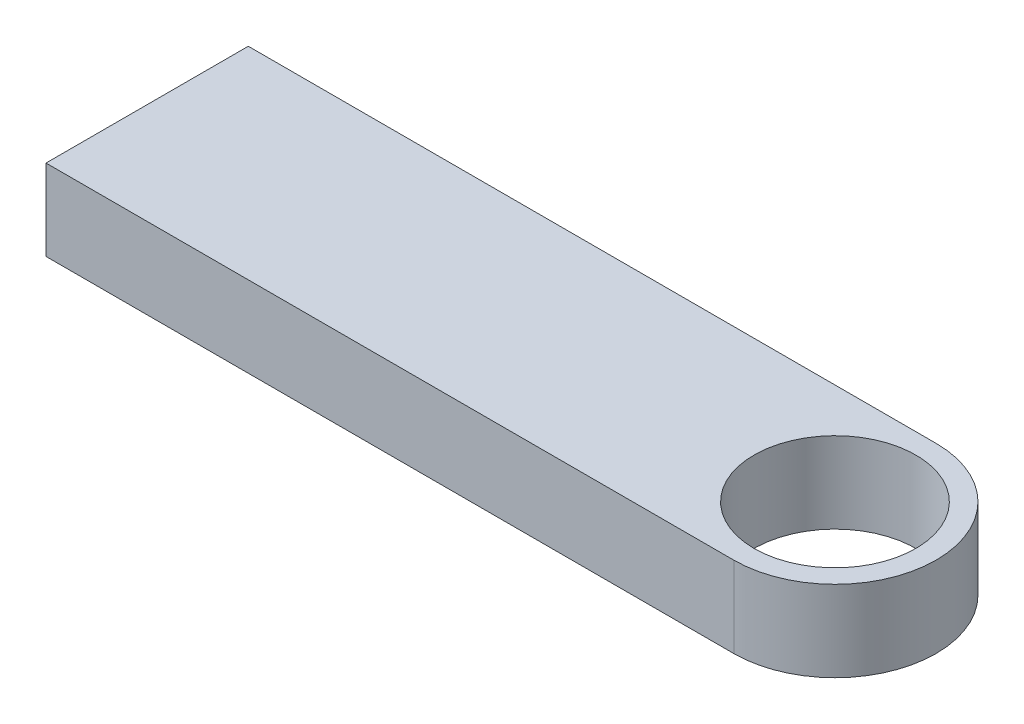
ISO-10303-21;
HEADER;
FILE_DESCRIPTION(('STEP AP214'),'2;1');
FILE_NAME('part.step','',(''),(''),'','','');
FILE_SCHEMA(('AUTOMOTIVE_DESIGN { 1 0 10303 214 1 1 1 1 }'));
ENDSEC;
DATA;
#1=APPLICATION_CONTEXT('core data for automotive mechanical design processes');
#2=APPLICATION_PROTOCOL_DEFINITION('international standard','automotive_design',2000,#1);
#3=PRODUCT_CONTEXT('',#1,'mechanical');
#4=PRODUCT('Part','Part','',(#3));
#5=PRODUCT_RELATED_PRODUCT_CATEGORY('part','',(#4));
#6=PRODUCT_DEFINITION_FORMATION('','',#4);
#7=PRODUCT_DEFINITION_CONTEXT('part definition',#1,'design');
#8=PRODUCT_DEFINITION('design','',#6,#7);
#9=PRODUCT_DEFINITION_SHAPE('','',#8);
#10=(LENGTH_UNIT() NAMED_UNIT(*) SI_UNIT(.MILLI.,.METRE.));
#11=(NAMED_UNIT(*) PLANE_ANGLE_UNIT() SI_UNIT($,.RADIAN.));
#12=(NAMED_UNIT(*) SI_UNIT($,.STERADIAN.) SOLID_ANGLE_UNIT());
#13=UNCERTAINTY_MEASURE_WITH_UNIT(LENGTH_MEASURE(1.E-05),#10,'distance_accuracy_value','');
#14=(GEOMETRIC_REPRESENTATION_CONTEXT(3) GLOBAL_UNCERTAINTY_ASSIGNED_CONTEXT((#13)) GLOBAL_UNIT_ASSIGNED_CONTEXT((#10,
#11,#12)) REPRESENTATION_CONTEXT('',''));
#15=CARTESIAN_POINT('',(0.,0.,0.));
#16=DIRECTION('',(0.,0.,1.));
#17=DIRECTION('',(1.,0.,0.));
#18=AXIS2_PLACEMENT_3D('',#15,#16,#17);
#19=CARTESIAN_POINT('',(0.,2.,0.));
#20=DIRECTION('',(0.,-1.,0.));
#21=DIRECTION('',(0.,0.,-1.));
#22=AXIS2_PLACEMENT_3D('',#19,#20,#21);
#23=CYLINDRICAL_SURFACE('',#22,2.5);
#24=CARTESIAN_POINT('',(0.,0.,0.));
#25=DIRECTION('',(0.,1.,0.));
#26=DIRECTION('',(0.,0.,1.));
#27=AXIS2_PLACEMENT_3D('',#24,#25,#26);
#28=CIRCLE('',#27,2.5);
#29=CARTESIAN_POINT('',(0.,0.,2.5));
#30=VERTEX_POINT('',#29);
#31=CARTESIAN_POINT('',(0.,0.,-2.5));
#32=VERTEX_POINT('',#31);
#33=EDGE_CURVE('E108',#30,#32,#28,.T.);
#34=ORIENTED_EDGE('',*,*,#33,.T.);
#35=DIRECTION('',(0.,-1.,0.));
#36=VECTOR('',#35,1.);
#37=CARTESIAN_POINT('',(0.,2.,-2.5));
#38=LINE('',#37,#36);
#39=CARTESIAN_POINT('',(0.,2.,-2.5));
#40=VERTEX_POINT('',#39);
#41=EDGE_CURVE('E11',#40,#32,#38,.T.);
#42=ORIENTED_EDGE('',*,*,#41,.F.);
#43=CARTESIAN_POINT('',(0.,2.,0.));
#44=DIRECTION('',(0.,1.,0.));
#45=DIRECTION('',(0.,0.,1.));
#46=AXIS2_PLACEMENT_3D('',#43,#44,#45);
#47=CIRCLE('',#46,2.5);
#48=CARTESIAN_POINT('',(0.,2.,2.5));
#49=VERTEX_POINT('',#48);
#50=EDGE_CURVE('E91',#49,#40,#47,.T.);
#51=ORIENTED_EDGE('',*,*,#50,.F.);
#52=DIRECTION('',(0.,-1.,0.));
#53=VECTOR('',#52,1.);
#54=CARTESIAN_POINT('',(0.,2.,2.5));
#55=LINE('',#54,#53);
#56=EDGE_CURVE('E104',#49,#30,#55,.T.);
#57=ORIENTED_EDGE('',*,*,#56,.T.);
#58=EDGE_LOOP('',(#34,#42,#51,#57));
#59=FACE_BOUND('',#58,.T.);
#60=ADVANCED_FACE('F38',(#59),#23,.T.);
#61=CARTESIAN_POINT('',(0.,2.,-2.5));
#62=DIRECTION('',(0.,0.,1.));
#63=DIRECTION('',(1.,0.,0.));
#64=AXIS2_PLACEMENT_3D('',#61,#62,#63);
#65=PLANE('',#64);
#66=DIRECTION('',(-1.,0.,0.));
#67=VECTOR('',#66,1.);
#68=CARTESIAN_POINT('',(0.,0.,-2.5));
#69=LINE('',#68,#67);
#70=CARTESIAN_POINT('',(-17.,0.,-2.5));
#71=VERTEX_POINT('',#70);
#72=EDGE_CURVE('E96',#32,#71,#69,.T.);
#73=ORIENTED_EDGE('',*,*,#72,.T.);
#74=DIRECTION('',(0.,-1.,0.));
#75=VECTOR('',#74,1.);
#76=CARTESIAN_POINT('',(-17.,2.,-2.5));
#77=LINE('',#76,#75);
#78=CARTESIAN_POINT('',(-17.,2.,-2.5));
#79=VERTEX_POINT('',#78);
#80=EDGE_CURVE('E48',#79,#71,#77,.T.);
#81=ORIENTED_EDGE('',*,*,#80,.F.);
#82=DIRECTION('',(-1.,0.,0.));
#83=VECTOR('',#82,1.);
#84=CARTESIAN_POINT('',(0.,2.,-2.5));
#85=LINE('',#84,#83);
#86=EDGE_CURVE('E86',#40,#79,#85,.T.);
#87=ORIENTED_EDGE('',*,*,#86,.F.);
#88=ORIENTED_EDGE('',*,*,#41,.T.);
#89=EDGE_LOOP('',(#73,#81,#87,#88));
#90=FACE_BOUND('',#89,.T.);
#91=ADVANCED_FACE('F95',(#90),#65,.F.);
#92=CARTESIAN_POINT('',(-17.,2.,-2.5));
#93=DIRECTION('',(1.,0.,0.));
#94=DIRECTION('',(0.,0.,-1.));
#95=AXIS2_PLACEMENT_3D('',#92,#93,#94);
#96=PLANE('',#95);
#97=DIRECTION('',(0.,0.,1.));
#98=VECTOR('',#97,1.);
#99=CARTESIAN_POINT('',(-17.,0.,-2.5));
#100=LINE('',#99,#98);
#101=CARTESIAN_POINT('',(-17.,0.,2.5));
#102=VERTEX_POINT('',#101);
#103=EDGE_CURVE('E73',#71,#102,#100,.T.);
#104=ORIENTED_EDGE('',*,*,#103,.T.);
#105=DIRECTION('',(0.,-1.,0.));
#106=VECTOR('',#105,1.);
#107=CARTESIAN_POINT('',(-17.,2.,2.5));
#108=LINE('',#107,#106);
#109=CARTESIAN_POINT('',(-17.,2.,2.5));
#110=VERTEX_POINT('',#109);
#111=EDGE_CURVE('E98',#110,#102,#108,.T.);
#112=ORIENTED_EDGE('',*,*,#111,.F.);
#113=DIRECTION('',(0.,0.,1.));
#114=VECTOR('',#113,1.);
#115=CARTESIAN_POINT('',(-17.,2.,-2.5));
#116=LINE('',#115,#114);
#117=EDGE_CURVE('E89',#79,#110,#116,.T.);
#118=ORIENTED_EDGE('',*,*,#117,.F.);
#119=ORIENTED_EDGE('',*,*,#80,.T.);
#120=EDGE_LOOP('',(#104,#112,#118,#119));
#121=FACE_BOUND('',#120,.T.);
#122=ADVANCED_FACE('F100',(#121),#96,.F.);
#123=CARTESIAN_POINT('',(-17.,2.,2.5));
#124=DIRECTION('',(0.,0.,-1.));
#125=DIRECTION('',(-1.,0.,0.));
#126=AXIS2_PLACEMENT_3D('',#123,#124,#125);
#127=PLANE('',#126);
#128=DIRECTION('',(1.,0.,0.));
#129=VECTOR('',#128,1.);
#130=CARTESIAN_POINT('',(-17.,0.,2.5));
#131=LINE('',#130,#129);
#132=EDGE_CURVE('E79',#102,#30,#131,.T.);
#133=ORIENTED_EDGE('',*,*,#132,.T.);
#134=ORIENTED_EDGE('',*,*,#56,.F.);
#135=DIRECTION('',(1.,0.,0.));
#136=VECTOR('',#135,1.);
#137=CARTESIAN_POINT('',(-17.,2.,2.5));
#138=LINE('',#137,#136);
#139=EDGE_CURVE('E56',#110,#49,#138,.T.);
#140=ORIENTED_EDGE('',*,*,#139,.F.);
#141=ORIENTED_EDGE('',*,*,#111,.T.);
#142=EDGE_LOOP('',(#133,#134,#140,#141));
#143=FACE_BOUND('',#142,.T.);
#144=ADVANCED_FACE('F121',(#143),#127,.F.);
#145=CARTESIAN_POINT('',(0.,2.,0.));
#146=DIRECTION('',(0.,1.,0.));
#147=DIRECTION('',(0.,0.,1.));
#148=AXIS2_PLACEMENT_3D('',#145,#146,#147);
#149=PLANE('',#148);
#150=CARTESIAN_POINT('',(0.,2.,0.));
#151=DIRECTION('',(0.,1.,0.));
#152=DIRECTION('',(0.,0.,1.));
#153=AXIS2_PLACEMENT_3D('',#150,#151,#152);
#154=CIRCLE('',#153,2.);
#155=CARTESIAN_POINT('',(0.,2.,2.));
#156=VERTEX_POINT('',#155);
#157=EDGE_CURVE('E128',#156,#156,#154,.T.);
#158=ORIENTED_EDGE('',*,*,#157,.F.);
#159=EDGE_LOOP('',(#158));
#160=FACE_BOUND('',#159,.T.);
#161=ORIENTED_EDGE('',*,*,#50,.T.);
#162=ORIENTED_EDGE('',*,*,#86,.T.);
#163=ORIENTED_EDGE('',*,*,#117,.T.);
#164=ORIENTED_EDGE('',*,*,#139,.T.);
#165=EDGE_LOOP('',(#161,#162,#163,#164));
#166=FACE_BOUND('',#165,.T.);
#167=ADVANCED_FACE('F87',(#160,#166),#149,.T.);
#168=CARTESIAN_POINT('',(0.,0.,0.));
#169=DIRECTION('',(0.,1.,0.));
#170=DIRECTION('',(0.,0.,1.));
#171=AXIS2_PLACEMENT_3D('',#168,#169,#170);
#172=PLANE('',#171);
#173=CARTESIAN_POINT('',(0.,0.,0.));
#174=DIRECTION('',(0.,1.,0.));
#175=DIRECTION('',(0.,0.,1.));
#176=AXIS2_PLACEMENT_3D('',#173,#174,#175);
#177=CIRCLE('',#176,2.);
#178=CARTESIAN_POINT('',(0.,0.,2.));
#179=VERTEX_POINT('',#178);
#180=EDGE_CURVE('E41',#179,#179,#177,.T.);
#181=ORIENTED_EDGE('',*,*,#180,.T.);
#182=EDGE_LOOP('',(#181));
#183=FACE_BOUND('',#182,.T.);
#184=ORIENTED_EDGE('',*,*,#33,.F.);
#185=ORIENTED_EDGE('',*,*,#132,.F.);
#186=ORIENTED_EDGE('',*,*,#103,.F.);
#187=ORIENTED_EDGE('',*,*,#72,.F.);
#188=EDGE_LOOP('',(#184,#185,#186,#187));
#189=FACE_BOUND('',#188,.T.);
#190=ADVANCED_FACE('F124',(#183,#189),#172,.F.);
#191=CARTESIAN_POINT('',(0.,-1.,0.));
#192=DIRECTION('',(0.,1.,0.));
#193=DIRECTION('',(0.,0.,1.));
#194=AXIS2_PLACEMENT_3D('',#191,#192,#193);
#195=CYLINDRICAL_SURFACE('',#194,2.);
#196=ORIENTED_EDGE('',*,*,#157,.T.);
#197=EDGE_LOOP('',(#196));
#198=FACE_BOUND('',#197,.T.);
#199=ORIENTED_EDGE('',*,*,#180,.F.);
#200=EDGE_LOOP('',(#199));
#201=FACE_BOUND('',#200,.T.);
#202=ADVANCED_FACE('F138',(#198,#201),#195,.F.);
#203=CLOSED_SHELL('',(#60,#91,#122,#144,#167,#190,#202));
#204=MANIFOLD_SOLID_BREP('B2',#203);
#205=ADVANCED_BREP_SHAPE_REPRESENTATION('',(#18,#204),#14);
#206=SHAPE_DEFINITION_REPRESENTATION(#9,#205);
ENDSEC;
END-ISO-10303-21;
